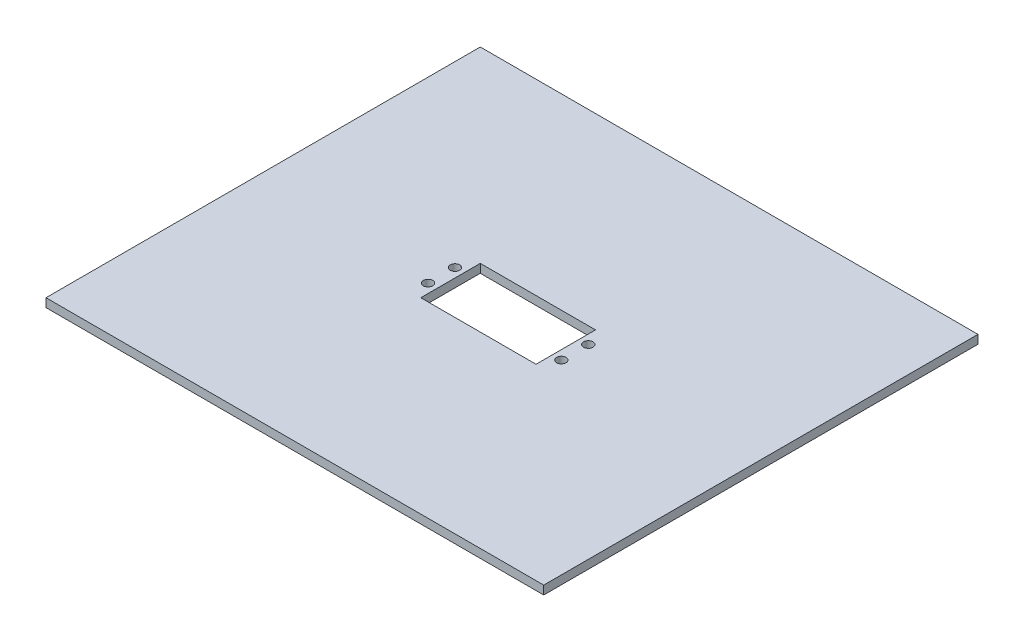
ISO-10303-21;
HEADER;
FILE_DESCRIPTION(('STEP AP214'),'2;1');
FILE_NAME('part.step','',(''),(''),'','','');
FILE_SCHEMA(('AUTOMOTIVE_DESIGN { 1 0 10303 214 1 1 1 1 }'));
ENDSEC;
DATA;
#1=APPLICATION_CONTEXT('core data for automotive mechanical design processes');
#2=APPLICATION_PROTOCOL_DEFINITION('international standard','automotive_design',2000,#1);
#3=PRODUCT_CONTEXT('',#1,'mechanical');
#4=PRODUCT('Part','Part','',(#3));
#5=PRODUCT_RELATED_PRODUCT_CATEGORY('part','',(#4));
#6=PRODUCT_DEFINITION_FORMATION('','',#4);
#7=PRODUCT_DEFINITION_CONTEXT('part definition',#1,'design');
#8=PRODUCT_DEFINITION('design','',#6,#7);
#9=PRODUCT_DEFINITION_SHAPE('','',#8);
#10=(LENGTH_UNIT() NAMED_UNIT(*) SI_UNIT(.MILLI.,.METRE.));
#11=(NAMED_UNIT(*) PLANE_ANGLE_UNIT() SI_UNIT($,.RADIAN.));
#12=(NAMED_UNIT(*) SI_UNIT($,.STERADIAN.) SOLID_ANGLE_UNIT());
#13=UNCERTAINTY_MEASURE_WITH_UNIT(LENGTH_MEASURE(1.E-05),#10,'distance_accuracy_value','');
#14=(GEOMETRIC_REPRESENTATION_CONTEXT(3) GLOBAL_UNCERTAINTY_ASSIGNED_CONTEXT((#13)) GLOBAL_UNIT_ASSIGNED_CONTEXT((#10,
#11,#12)) REPRESENTATION_CONTEXT('',''));
#15=CARTESIAN_POINT('',(0.,0.,0.));
#16=DIRECTION('',(0.,0.,1.));
#17=DIRECTION('',(1.,0.,0.));
#18=AXIS2_PLACEMENT_3D('',#15,#16,#17);
#19=CARTESIAN_POINT('',(-80.6395610261527,-3.19999999999997,-80.6395610261527));
#20=DIRECTION('',(-1.,0.,0.));
#21=DIRECTION('',(0.,0.,1.));
#22=AXIS2_PLACEMENT_3D('',#19,#20,#21);
#23=PLANE('',#22);
#24=DIRECTION('',(0.,0.,1.));
#25=VECTOR('',#24,1.);
#26=CARTESIAN_POINT('',(-80.6395610261527,0.,-80.6395610261527));
#27=LINE('',#26,#25);
#28=CARTESIAN_POINT('',(-80.6395610261527,0.,-80.6395610261527));
#29=VERTEX_POINT('',#28);
#30=CARTESIAN_POINT('',(-80.6395610261527,0.,80.6395610261527));
#31=VERTEX_POINT('',#30);
#32=EDGE_CURVE('E156',#29,#31,#27,.T.);
#33=ORIENTED_EDGE('',*,*,#32,.F.);
#34=DIRECTION('',(0.,1.,0.));
#35=VECTOR('',#34,1.);
#36=CARTESIAN_POINT('',(-80.6395610261527,-3.19999999999997,-80.6395610261527));
#37=LINE('',#36,#35);
#38=CARTESIAN_POINT('',(-80.6395610261527,-3.19999999999997,-80.6395610261527));
#39=VERTEX_POINT('',#38);
#40=EDGE_CURVE('E11',#39,#29,#37,.T.);
#41=ORIENTED_EDGE('',*,*,#40,.F.);
#42=DIRECTION('',(0.,0.,1.));
#43=VECTOR('',#42,1.);
#44=CARTESIAN_POINT('',(-80.6395610261527,-3.19999999999997,-80.6395610261527));
#45=LINE('',#44,#43);
#46=CARTESIAN_POINT('',(-80.6395610261527,-3.19999999999997,80.6395610261527));
#47=VERTEX_POINT('',#46);
#48=EDGE_CURVE('E159',#39,#47,#45,.T.);
#49=ORIENTED_EDGE('',*,*,#48,.T.);
#50=DIRECTION('',(0.,1.,0.));
#51=VECTOR('',#50,1.);
#52=CARTESIAN_POINT('',(-80.6395610261527,-3.19999999999997,80.6395610261527));
#53=LINE('',#52,#51);
#54=EDGE_CURVE('E36',#47,#31,#53,.T.);
#55=ORIENTED_EDGE('',*,*,#54,.T.);
#56=EDGE_LOOP('',(#33,#41,#49,#55));
#57=FACE_BOUND('',#56,.T.);
#58=ADVANCED_FACE('F33',(#57),#23,.T.);
#59=CARTESIAN_POINT('',(-80.6395610261527,-3.19999999999997,-80.6395610261527));
#60=DIRECTION('',(0.,0.,-1.));
#61=DIRECTION('',(-1.,0.,0.));
#62=AXIS2_PLACEMENT_3D('',#59,#60,#61);
#63=PLANE('',#62);
#64=DIRECTION('',(-1.,0.,0.));
#65=VECTOR('',#64,1.);
#66=CARTESIAN_POINT('',(-80.6395610261527,0.,-80.6395610261527));
#67=LINE('',#66,#65);
#68=CARTESIAN_POINT('',(104.2,0.,-80.6395610261527));
#69=VERTEX_POINT('',#68);
#70=EDGE_CURVE('E163',#69,#29,#67,.T.);
#71=ORIENTED_EDGE('',*,*,#70,.F.);
#72=DIRECTION('',(0.,1.,0.));
#73=VECTOR('',#72,1.);
#74=CARTESIAN_POINT('',(104.2,-3.19999999999997,-80.6395610261527));
#75=LINE('',#74,#73);
#76=CARTESIAN_POINT('',(104.2,-3.19999999999997,-80.6395610261527));
#77=VERTEX_POINT('',#76);
#78=EDGE_CURVE('E41',#77,#69,#75,.T.);
#79=ORIENTED_EDGE('',*,*,#78,.F.);
#80=DIRECTION('',(-1.,0.,0.));
#81=VECTOR('',#80,1.);
#82=CARTESIAN_POINT('',(-80.6395610261527,-3.19999999999997,-80.6395610261527));
#83=LINE('',#82,#81);
#84=EDGE_CURVE('E169',#77,#39,#83,.T.);
#85=ORIENTED_EDGE('',*,*,#84,.T.);
#86=ORIENTED_EDGE('',*,*,#40,.T.);
#87=EDGE_LOOP('',(#71,#79,#85,#86));
#88=FACE_BOUND('',#87,.T.);
#89=ADVANCED_FACE('F195',(#88),#63,.T.);
#90=CARTESIAN_POINT('',(104.2,-3.19999999999997,80.6395610261527));
#91=DIRECTION('',(1.,0.,0.));
#92=DIRECTION('',(0.,0.,-1.));
#93=AXIS2_PLACEMENT_3D('',#90,#91,#92);
#94=PLANE('',#93);
#95=DIRECTION('',(0.,0.,-1.));
#96=VECTOR('',#95,1.);
#97=CARTESIAN_POINT('',(104.2,0.,80.6395610261527));
#98=LINE('',#97,#96);
#99=CARTESIAN_POINT('',(104.2,0.,80.6395610261527));
#100=VERTEX_POINT('',#99);
#101=EDGE_CURVE('E177',#100,#69,#98,.T.);
#102=ORIENTED_EDGE('',*,*,#101,.F.);
#103=DIRECTION('',(0.,1.,0.));
#104=VECTOR('',#103,1.);
#105=CARTESIAN_POINT('',(104.2,-3.19999999999997,80.6395610261527));
#106=LINE('',#105,#104);
#107=CARTESIAN_POINT('',(104.2,-3.19999999999997,80.6395610261527));
#108=VERTEX_POINT('',#107);
#109=EDGE_CURVE('E182',#108,#100,#106,.T.);
#110=ORIENTED_EDGE('',*,*,#109,.F.);
#111=DIRECTION('',(0.,0.,-1.));
#112=VECTOR('',#111,1.);
#113=CARTESIAN_POINT('',(104.2,-3.19999999999997,80.6395610261527));
#114=LINE('',#113,#112);
#115=EDGE_CURVE('E166',#108,#77,#114,.T.);
#116=ORIENTED_EDGE('',*,*,#115,.T.);
#117=ORIENTED_EDGE('',*,*,#78,.T.);
#118=EDGE_LOOP('',(#102,#110,#116,#117));
#119=FACE_BOUND('',#118,.T.);
#120=ADVANCED_FACE('F200',(#119),#94,.T.);
#121=CARTESIAN_POINT('',(-80.6395610261527,-3.19999999999997,80.6395610261527));
#122=DIRECTION('',(0.,0.,1.));
#123=DIRECTION('',(1.,0.,0.));
#124=AXIS2_PLACEMENT_3D('',#121,#122,#123);
#125=PLANE('',#124);
#126=DIRECTION('',(1.,0.,0.));
#127=VECTOR('',#126,1.);
#128=CARTESIAN_POINT('',(-80.6395610261527,0.,80.6395610261527));
#129=LINE('',#128,#127);
#130=EDGE_CURVE('E174',#31,#100,#129,.T.);
#131=ORIENTED_EDGE('',*,*,#130,.F.);
#132=ORIENTED_EDGE('',*,*,#54,.F.);
#133=DIRECTION('',(1.,0.,0.));
#134=VECTOR('',#133,1.);
#135=CARTESIAN_POINT('',(-80.6395610261527,-3.19999999999997,80.6395610261527));
#136=LINE('',#135,#134);
#137=EDGE_CURVE('E162',#47,#108,#136,.T.);
#138=ORIENTED_EDGE('',*,*,#137,.T.);
#139=ORIENTED_EDGE('',*,*,#109,.T.);
#140=EDGE_LOOP('',(#131,#132,#138,#139));
#141=FACE_BOUND('',#140,.T.);
#142=ADVANCED_FACE('F190',(#141),#125,.T.);
#143=CARTESIAN_POINT('',(0.,-3.19999999999997,0.));
#144=DIRECTION('',(0.,1.,0.));
#145=DIRECTION('',(0.,0.,1.));
#146=AXIS2_PLACEMENT_3D('',#143,#144,#145);
#147=PLANE('',#146);
#148=DIRECTION('',(1.,0.,0.));
#149=VECTOR('',#148,1.);
#150=CARTESIAN_POINT('',(31.75,-3.19999999999997,11.0499999999999));
#151=LINE('',#150,#149);
#152=CARTESIAN_POINT('',(-11.05,-3.19999999999997,11.0499999999999));
#153=VERTEX_POINT('',#152);
#154=CARTESIAN_POINT('',(31.75,-3.19999999999997,11.0499999999999));
#155=VERTEX_POINT('',#154);
#156=EDGE_CURVE('E106',#153,#155,#151,.T.);
#157=ORIENTED_EDGE('',*,*,#156,.T.);
#158=DIRECTION('',(0.,0.,-1.));
#159=VECTOR('',#158,1.);
#160=CARTESIAN_POINT('',(31.75,-3.19999999999997,-11.0500000000001));
#161=LINE('',#160,#159);
#162=CARTESIAN_POINT('',(31.75,-3.19999999999997,-11.0500000000001));
#163=VERTEX_POINT('',#162);
#164=EDGE_CURVE('E100',#155,#163,#161,.T.);
#165=ORIENTED_EDGE('',*,*,#164,.T.);
#166=DIRECTION('',(-1.,0.,0.));
#167=VECTOR('',#166,1.);
#168=CARTESIAN_POINT('',(31.75,-3.19999999999997,-11.0500000000001));
#169=LINE('',#168,#167);
#170=CARTESIAN_POINT('',(-11.05,-3.19999999999997,-11.0500000000001));
#171=VERTEX_POINT('',#170);
#172=EDGE_CURVE('E109',#163,#171,#169,.T.);
#173=ORIENTED_EDGE('',*,*,#172,.T.);
#174=DIRECTION('',(0.,0.,1.));
#175=VECTOR('',#174,1.);
#176=CARTESIAN_POINT('',(-11.05,-3.19999999999997,-11.0500000000001));
#177=LINE('',#176,#175);
#178=EDGE_CURVE('E49',#171,#153,#177,.T.);
#179=ORIENTED_EDGE('',*,*,#178,.T.);
#180=EDGE_LOOP('',(#157,#165,#173,#179));
#181=FACE_BOUND('',#180,.T.);
#182=CARTESIAN_POINT('',(35.1,-3.19999999999997,-5.00000000000006));
#183=DIRECTION('',(0.,1.,0.));
#184=DIRECTION('',(0.,0.,1.));
#185=AXIS2_PLACEMENT_3D('',#182,#183,#184);
#186=CIRCLE('',#185,1.75);
#187=CARTESIAN_POINT('',(35.1,-3.19999999999997,-3.25000000000006));
#188=VERTEX_POINT('',#187);
#189=EDGE_CURVE('E135',#188,#188,#186,.T.);
#190=ORIENTED_EDGE('',*,*,#189,.T.);
#191=EDGE_LOOP('',(#190));
#192=FACE_BOUND('',#191,.T.);
#193=CARTESIAN_POINT('',(35.1,-3.19999999999997,4.99999999999994));
#194=DIRECTION('',(0.,1.,0.));
#195=DIRECTION('',(0.,0.,1.));
#196=AXIS2_PLACEMENT_3D('',#193,#194,#195);
#197=CIRCLE('',#196,1.75);
#198=CARTESIAN_POINT('',(35.1,-3.19999999999997,6.74999999999994));
#199=VERTEX_POINT('',#198);
#200=EDGE_CURVE('E141',#199,#199,#197,.T.);
#201=ORIENTED_EDGE('',*,*,#200,.T.);
#202=EDGE_LOOP('',(#201));
#203=FACE_BOUND('',#202,.T.);
#204=CARTESIAN_POINT('',(-14.4,-3.19999999999997,4.99999999999999));
#205=DIRECTION('',(0.,1.,0.));
#206=DIRECTION('',(0.,0.,1.));
#207=AXIS2_PLACEMENT_3D('',#204,#205,#206);
#208=CIRCLE('',#207,1.75);
#209=CARTESIAN_POINT('',(-14.4,-3.19999999999997,6.74999999999998));
#210=VERTEX_POINT('',#209);
#211=EDGE_CURVE('E147',#210,#210,#208,.T.);
#212=ORIENTED_EDGE('',*,*,#211,.T.);
#213=EDGE_LOOP('',(#212));
#214=FACE_BOUND('',#213,.T.);
#215=CARTESIAN_POINT('',(-14.4,-3.19999999999997,-5.00000000000002));
#216=DIRECTION('',(0.,1.,0.));
#217=DIRECTION('',(0.,0.,1.));
#218=AXIS2_PLACEMENT_3D('',#215,#216,#217);
#219=CIRCLE('',#218,1.75);
#220=CARTESIAN_POINT('',(-14.4,-3.19999999999997,-3.25000000000002));
#221=VERTEX_POINT('',#220);
#222=EDGE_CURVE('E153',#221,#221,#219,.T.);
#223=ORIENTED_EDGE('',*,*,#222,.T.);
#224=EDGE_LOOP('',(#223));
#225=FACE_BOUND('',#224,.T.);
#226=ORIENTED_EDGE('',*,*,#48,.F.);
#227=ORIENTED_EDGE('',*,*,#84,.F.);
#228=ORIENTED_EDGE('',*,*,#115,.F.);
#229=ORIENTED_EDGE('',*,*,#137,.F.);
#230=EDGE_LOOP('',(#226,#227,#228,#229));
#231=FACE_BOUND('',#230,.T.);
#232=ADVANCED_FACE('F113',(#181,#192,#203,#214,#225,#231),#147,.F.);
#233=CARTESIAN_POINT('',(0.,0.,0.));
#234=DIRECTION('',(0.,1.,0.));
#235=DIRECTION('',(0.,0.,1.));
#236=AXIS2_PLACEMENT_3D('',#233,#234,#235);
#237=PLANE('',#236);
#238=DIRECTION('',(0.,0.,-1.));
#239=VECTOR('',#238,1.);
#240=CARTESIAN_POINT('',(31.75,0.,-11.0500000000001));
#241=LINE('',#240,#239);
#242=CARTESIAN_POINT('',(31.75,0.,11.0499999999999));
#243=VERTEX_POINT('',#242);
#244=CARTESIAN_POINT('',(31.75,0.,-11.0500000000001));
#245=VERTEX_POINT('',#244);
#246=EDGE_CURVE('E57',#243,#245,#241,.T.);
#247=ORIENTED_EDGE('',*,*,#246,.F.);
#248=DIRECTION('',(1.,0.,0.));
#249=VECTOR('',#248,1.);
#250=CARTESIAN_POINT('',(31.75,0.,11.0499999999999));
#251=LINE('',#250,#249);
#252=CARTESIAN_POINT('',(-11.05,0.,11.0499999999999));
#253=VERTEX_POINT('',#252);
#254=EDGE_CURVE('E116',#253,#243,#251,.T.);
#255=ORIENTED_EDGE('',*,*,#254,.F.);
#256=DIRECTION('',(0.,0.,1.));
#257=VECTOR('',#256,1.);
#258=CARTESIAN_POINT('',(-11.05,0.,-11.0500000000001));
#259=LINE('',#258,#257);
#260=CARTESIAN_POINT('',(-11.05,0.,-11.0500000000001));
#261=VERTEX_POINT('',#260);
#262=EDGE_CURVE('E119',#261,#253,#259,.T.);
#263=ORIENTED_EDGE('',*,*,#262,.F.);
#264=DIRECTION('',(-1.,0.,0.));
#265=VECTOR('',#264,1.);
#266=CARTESIAN_POINT('',(31.75,0.,-11.0500000000001));
#267=LINE('',#266,#265);
#268=EDGE_CURVE('E125',#245,#261,#267,.T.);
#269=ORIENTED_EDGE('',*,*,#268,.F.);
#270=EDGE_LOOP('',(#247,#255,#263,#269));
#271=FACE_BOUND('',#270,.T.);
#272=CARTESIAN_POINT('',(35.1,0.,-5.00000000000006));
#273=DIRECTION('',(0.,1.,0.));
#274=DIRECTION('',(0.,0.,1.));
#275=AXIS2_PLACEMENT_3D('',#272,#273,#274);
#276=CIRCLE('',#275,1.75);
#277=CARTESIAN_POINT('',(35.1,0.,-3.25000000000006));
#278=VERTEX_POINT('',#277);
#279=EDGE_CURVE('E131',#278,#278,#276,.T.);
#280=ORIENTED_EDGE('',*,*,#279,.F.);
#281=EDGE_LOOP('',(#280));
#282=FACE_BOUND('',#281,.T.);
#283=CARTESIAN_POINT('',(35.1,0.,4.99999999999994));
#284=DIRECTION('',(0.,1.,0.));
#285=DIRECTION('',(0.,0.,1.));
#286=AXIS2_PLACEMENT_3D('',#283,#284,#285);
#287=CIRCLE('',#286,1.75);
#288=CARTESIAN_POINT('',(35.1,0.,6.74999999999994));
#289=VERTEX_POINT('',#288);
#290=EDGE_CURVE('E138',#289,#289,#287,.T.);
#291=ORIENTED_EDGE('',*,*,#290,.F.);
#292=EDGE_LOOP('',(#291));
#293=FACE_BOUND('',#292,.T.);
#294=CARTESIAN_POINT('',(-14.4,0.,4.99999999999999));
#295=DIRECTION('',(0.,1.,0.));
#296=DIRECTION('',(0.,0.,1.));
#297=AXIS2_PLACEMENT_3D('',#294,#295,#296);
#298=CIRCLE('',#297,1.75);
#299=CARTESIAN_POINT('',(-14.4,0.,6.74999999999998));
#300=VERTEX_POINT('',#299);
#301=EDGE_CURVE('E144',#300,#300,#298,.T.);
#302=ORIENTED_EDGE('',*,*,#301,.F.);
#303=EDGE_LOOP('',(#302));
#304=FACE_BOUND('',#303,.T.);
#305=CARTESIAN_POINT('',(-14.4,0.,-5.00000000000002));
#306=DIRECTION('',(0.,1.,0.));
#307=DIRECTION('',(0.,0.,1.));
#308=AXIS2_PLACEMENT_3D('',#305,#306,#307);
#309=CIRCLE('',#308,1.75);
#310=CARTESIAN_POINT('',(-14.4,0.,-3.25000000000002));
#311=VERTEX_POINT('',#310);
#312=EDGE_CURVE('E150',#311,#311,#309,.T.);
#313=ORIENTED_EDGE('',*,*,#312,.F.);
#314=EDGE_LOOP('',(#313));
#315=FACE_BOUND('',#314,.T.);
#316=ORIENTED_EDGE('',*,*,#32,.T.);
#317=ORIENTED_EDGE('',*,*,#130,.T.);
#318=ORIENTED_EDGE('',*,*,#101,.T.);
#319=ORIENTED_EDGE('',*,*,#70,.T.);
#320=EDGE_LOOP('',(#316,#317,#318,#319));
#321=FACE_BOUND('',#320,.T.);
#322=ADVANCED_FACE('F192',(#271,#282,#293,#304,#315,#321),#237,.T.);
#323=CARTESIAN_POINT('',(-14.4,-3.19999999999997,-5.00000000000002));
#324=DIRECTION('',(0.,1.,0.));
#325=DIRECTION('',(0.,0.,1.));
#326=AXIS2_PLACEMENT_3D('',#323,#324,#325);
#327=CYLINDRICAL_SURFACE('',#326,1.75);
#328=ORIENTED_EDGE('',*,*,#222,.F.);
#329=EDGE_LOOP('',(#328));
#330=FACE_BOUND('',#329,.T.);
#331=ORIENTED_EDGE('',*,*,#312,.T.);
#332=EDGE_LOOP('',(#331));
#333=FACE_BOUND('',#332,.T.);
#334=ADVANCED_FACE('F242',(#330,#333),#327,.F.);
#335=CARTESIAN_POINT('',(-14.4,-3.19999999999997,4.99999999999999));
#336=DIRECTION('',(0.,1.,0.));
#337=DIRECTION('',(0.,0.,1.));
#338=AXIS2_PLACEMENT_3D('',#335,#336,#337);
#339=CYLINDRICAL_SURFACE('',#338,1.75);
#340=ORIENTED_EDGE('',*,*,#211,.F.);
#341=EDGE_LOOP('',(#340));
#342=FACE_BOUND('',#341,.T.);
#343=ORIENTED_EDGE('',*,*,#301,.T.);
#344=EDGE_LOOP('',(#343));
#345=FACE_BOUND('',#344,.T.);
#346=ADVANCED_FACE('F252',(#342,#345),#339,.F.);
#347=CARTESIAN_POINT('',(35.1,-3.19999999999997,4.99999999999994));
#348=DIRECTION('',(0.,1.,0.));
#349=DIRECTION('',(0.,0.,1.));
#350=AXIS2_PLACEMENT_3D('',#347,#348,#349);
#351=CYLINDRICAL_SURFACE('',#350,1.75);
#352=ORIENTED_EDGE('',*,*,#200,.F.);
#353=EDGE_LOOP('',(#352));
#354=FACE_BOUND('',#353,.T.);
#355=ORIENTED_EDGE('',*,*,#290,.T.);
#356=EDGE_LOOP('',(#355));
#357=FACE_BOUND('',#356,.T.);
#358=ADVANCED_FACE('F262',(#354,#357),#351,.F.);
#359=CARTESIAN_POINT('',(35.1,-3.19999999999997,-5.00000000000006));
#360=DIRECTION('',(0.,1.,0.));
#361=DIRECTION('',(0.,0.,1.));
#362=AXIS2_PLACEMENT_3D('',#359,#360,#361);
#363=CYLINDRICAL_SURFACE('',#362,1.75);
#364=ORIENTED_EDGE('',*,*,#189,.F.);
#365=EDGE_LOOP('',(#364));
#366=FACE_BOUND('',#365,.T.);
#367=ORIENTED_EDGE('',*,*,#279,.T.);
#368=EDGE_LOOP('',(#367));
#369=FACE_BOUND('',#368,.T.);
#370=ADVANCED_FACE('F272',(#366,#369),#363,.F.);
#371=CARTESIAN_POINT('',(31.75,-3.19999999999997,-11.0500000000001));
#372=DIRECTION('',(1.,0.,0.));
#373=DIRECTION('',(0.,0.,-1.));
#374=AXIS2_PLACEMENT_3D('',#371,#372,#373);
#375=PLANE('',#374);
#376=ORIENTED_EDGE('',*,*,#246,.T.);
#377=DIRECTION('',(0.,1.,0.));
#378=VECTOR('',#377,1.);
#379=CARTESIAN_POINT('',(31.75,-3.19999999999997,-11.0500000000001));
#380=LINE('',#379,#378);
#381=EDGE_CURVE('E96',#163,#245,#380,.T.);
#382=ORIENTED_EDGE('',*,*,#381,.F.);
#383=ORIENTED_EDGE('',*,*,#164,.F.);
#384=DIRECTION('',(0.,1.,0.));
#385=VECTOR('',#384,1.);
#386=CARTESIAN_POINT('',(31.75,-3.19999999999997,11.0499999999999));
#387=LINE('',#386,#385);
#388=EDGE_CURVE('E129',#155,#243,#387,.T.);
#389=ORIENTED_EDGE('',*,*,#388,.T.);
#390=EDGE_LOOP('',(#376,#382,#383,#389));
#391=FACE_BOUND('',#390,.T.);
#392=ADVANCED_FACE('F98',(#391),#375,.F.);
#393=CARTESIAN_POINT('',(31.75,-3.19999999999997,11.0499999999999));
#394=DIRECTION('',(0.,0.,1.));
#395=DIRECTION('',(1.,0.,0.));
#396=AXIS2_PLACEMENT_3D('',#393,#394,#395);
#397=PLANE('',#396);
#398=ORIENTED_EDGE('',*,*,#254,.T.);
#399=ORIENTED_EDGE('',*,*,#388,.F.);
#400=ORIENTED_EDGE('',*,*,#156,.F.);
#401=DIRECTION('',(0.,1.,0.));
#402=VECTOR('',#401,1.);
#403=CARTESIAN_POINT('',(-11.05,-3.19999999999997,11.0499999999999));
#404=LINE('',#403,#402);
#405=EDGE_CURVE('E132',#153,#253,#404,.T.);
#406=ORIENTED_EDGE('',*,*,#405,.T.);
#407=EDGE_LOOP('',(#398,#399,#400,#406));
#408=FACE_BOUND('',#407,.T.);
#409=ADVANCED_FACE('F291',(#408),#397,.F.);
#410=CARTESIAN_POINT('',(-11.05,-3.19999999999997,-11.0500000000001));
#411=DIRECTION('',(-1.,0.,0.));
#412=DIRECTION('',(0.,0.,1.));
#413=AXIS2_PLACEMENT_3D('',#410,#411,#412);
#414=PLANE('',#413);
#415=ORIENTED_EDGE('',*,*,#262,.T.);
#416=ORIENTED_EDGE('',*,*,#405,.F.);
#417=ORIENTED_EDGE('',*,*,#178,.F.);
#418=DIRECTION('',(0.,1.,0.));
#419=VECTOR('',#418,1.);
#420=CARTESIAN_POINT('',(-11.05,-3.19999999999997,-11.0500000000001));
#421=LINE('',#420,#419);
#422=EDGE_CURVE('E105',#171,#261,#421,.T.);
#423=ORIENTED_EDGE('',*,*,#422,.T.);
#424=EDGE_LOOP('',(#415,#416,#417,#423));
#425=FACE_BOUND('',#424,.T.);
#426=ADVANCED_FACE('F300',(#425),#414,.F.);
#427=CARTESIAN_POINT('',(31.75,-3.19999999999997,-11.0500000000001));
#428=DIRECTION('',(0.,0.,-1.));
#429=DIRECTION('',(-1.,0.,0.));
#430=AXIS2_PLACEMENT_3D('',#427,#428,#429);
#431=PLANE('',#430);
#432=ORIENTED_EDGE('',*,*,#268,.T.);
#433=ORIENTED_EDGE('',*,*,#422,.F.);
#434=ORIENTED_EDGE('',*,*,#172,.F.);
#435=ORIENTED_EDGE('',*,*,#381,.T.);
#436=EDGE_LOOP('',(#432,#433,#434,#435));
#437=FACE_BOUND('',#436,.T.);
#438=ADVANCED_FACE('F110',(#437),#431,.F.);
#439=CLOSED_SHELL('',(#58,#89,#120,#142,#232,#322,#334,#346,#358,#370,#392,#409,#426,#438));
#440=MANIFOLD_SOLID_BREP('B2',#439);
#441=ADVANCED_BREP_SHAPE_REPRESENTATION('',(#18,#440),#14);
#442=SHAPE_DEFINITION_REPRESENTATION(#9,#441);
ENDSEC;
END-ISO-10303-21;
